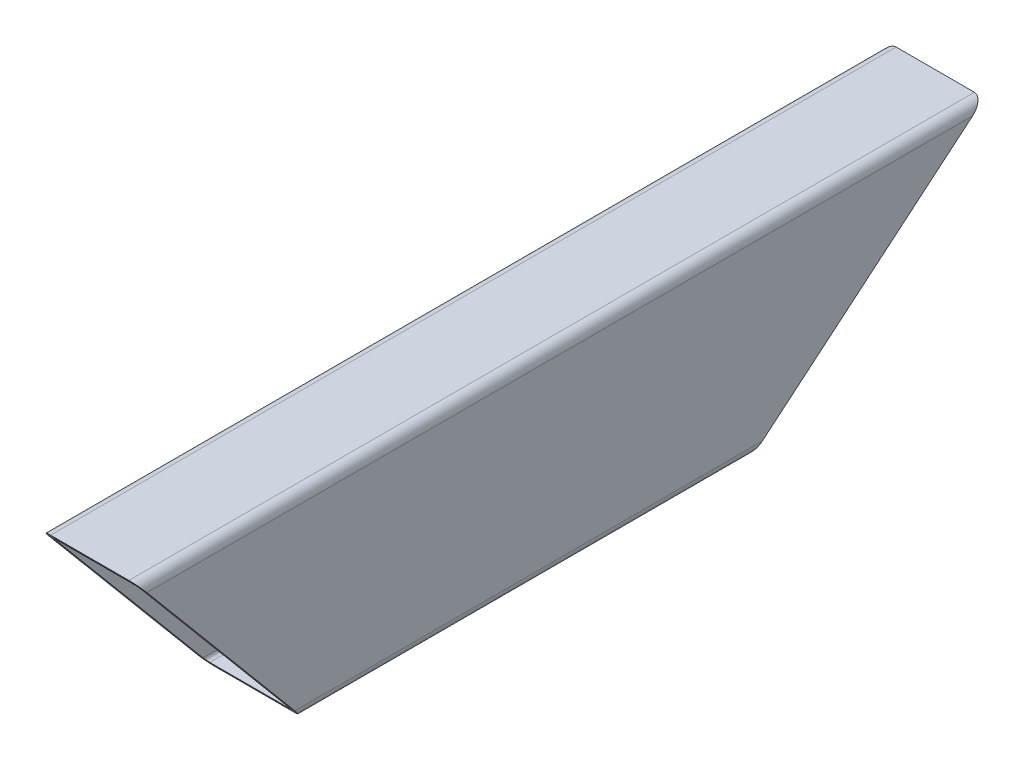
ISO-10303-21;
HEADER;
FILE_DESCRIPTION(('STEP AP214'),'2;1');
FILE_NAME('part.step','',(''),(''),'','','');
FILE_SCHEMA(('AUTOMOTIVE_DESIGN { 1 0 10303 214 1 1 1 1 }'));
ENDSEC;
DATA;
#1=APPLICATION_CONTEXT('core data for automotive mechanical design processes');
#2=APPLICATION_PROTOCOL_DEFINITION('international standard','automotive_design',2000,#1);
#3=PRODUCT_CONTEXT('',#1,'mechanical');
#4=PRODUCT('Part','Part','',(#3));
#5=PRODUCT_RELATED_PRODUCT_CATEGORY('part','',(#4));
#6=PRODUCT_DEFINITION_FORMATION('','',#4);
#7=PRODUCT_DEFINITION_CONTEXT('part definition',#1,'design');
#8=PRODUCT_DEFINITION('design','',#6,#7);
#9=PRODUCT_DEFINITION_SHAPE('','',#8);
#10=(LENGTH_UNIT() NAMED_UNIT(*) SI_UNIT(.MILLI.,.METRE.));
#11=(NAMED_UNIT(*) PLANE_ANGLE_UNIT() SI_UNIT($,.RADIAN.));
#12=(NAMED_UNIT(*) SI_UNIT($,.STERADIAN.) SOLID_ANGLE_UNIT());
#13=UNCERTAINTY_MEASURE_WITH_UNIT(LENGTH_MEASURE(1.E-05),#10,'distance_accuracy_value','');
#14=(GEOMETRIC_REPRESENTATION_CONTEXT(3) GLOBAL_UNCERTAINTY_ASSIGNED_CONTEXT((#13)) GLOBAL_UNIT_ASSIGNED_CONTEXT((#10,
#11,#12)) REPRESENTATION_CONTEXT('',''));
#15=CARTESIAN_POINT('',(0.,0.,0.));
#16=DIRECTION('',(0.,0.,1.));
#17=DIRECTION('',(1.,0.,0.));
#18=AXIS2_PLACEMENT_3D('',#15,#16,#17);
#19=CARTESIAN_POINT('',(-11.1125,-22.86,219.218051789231));
#20=DIRECTION('',(1.,0.,0.));
#21=DIRECTION('',(0.,0.,-1.));
#22=AXIS2_PLACEMENT_3D('',#19,#20,#21);
#23=PLANE('',#22);
#24=DIRECTION('',(0.,0.766044443118982,0.642787609686535));
#25=VECTOR('',#24,1.);
#26=CARTESIAN_POINT('',(-11.1125,-2.9201305271033,195.454640709046));
#27=LINE('',#26,#25);
#28=CARTESIAN_POINT('',(-11.1125,-22.86,178.723103588616));
#29=VERTEX_POINT('',#28);
#30=CARTESIAN_POINT('',(-11.1125,22.86,217.086738726041));
#31=VERTEX_POINT('',#30);
#32=EDGE_CURVE('E12',#29,#31,#27,.T.);
#33=ORIENTED_EDGE('',*,*,#32,.F.);
#34=DIRECTION('',(0.,0.,-1.));
#35=VECTOR('',#34,1.);
#36=CARTESIAN_POINT('',(-11.1125,-22.86,219.218051789231));
#37=LINE('',#36,#35);
#38=CARTESIAN_POINT('',(-11.1125,-22.86,57.5140283785972));
#39=VERTEX_POINT('',#38);
#40=EDGE_CURVE('E289',#29,#39,#37,.T.);
#41=ORIENTED_EDGE('',*,*,#40,.T.);
#42=DIRECTION('',(0.,-0.642787609686535,0.766044443118982));
#43=VECTOR('',#42,1.);
#44=CARTESIAN_POINT('',(-11.1125,-102.48368797403,152.405844577249));
#45=LINE('',#44,#43);
#46=CARTESIAN_POINT('',(-11.1125,22.86,3.02705412518935));
#47=VERTEX_POINT('',#46);
#48=EDGE_CURVE('E103',#47,#39,#45,.T.);
#49=ORIENTED_EDGE('',*,*,#48,.F.);
#50=DIRECTION('',(0.,0.,-1.));
#51=VECTOR('',#50,1.);
#52=CARTESIAN_POINT('',(-11.1125,22.86,219.218051789231));
#53=LINE('',#52,#51);
#54=EDGE_CURVE('E297',#31,#47,#53,.T.);
#55=ORIENTED_EDGE('',*,*,#54,.F.);
#56=EDGE_LOOP('',(#33,#41,#49,#55));
#57=FACE_BOUND('',#56,.T.);
#58=ADVANCED_FACE('F95',(#57),#23,.T.);
#59=CARTESIAN_POINT('',(-10.16,22.86,219.218051789231));
#60=DIRECTION('',(0.,0.,-1.));
#61=DIRECTION('',(-1.,0.,0.));
#62=AXIS2_PLACEMENT_3D('',#59,#60,#61);
#63=CYLINDRICAL_SURFACE('',#62,0.9525);
#64=CARTESIAN_POINT('',(-10.16,22.86,217.086738726041));
#65=DIRECTION('',(0.,0.642787609686535,-0.766044443118982));
#66=DIRECTION('',(0.,-0.766044443118982,-0.642787609686535));
#67=AXIS2_PLACEMENT_3D('',#64,#65,#66);
#68=ELLIPSE('',#67,1.24340044308899,0.9525);
#69=CARTESIAN_POINT('',(-10.16,23.8125,217.885981124737));
#70=VERTEX_POINT('',#69);
#71=EDGE_CURVE('E365',#31,#70,#68,.T.);
#72=ORIENTED_EDGE('',*,*,#71,.F.);
#73=ORIENTED_EDGE('',*,*,#54,.T.);
#74=CARTESIAN_POINT('',(-10.16,22.86,3.0270541251893));
#75=DIRECTION('',(0.,0.766044443118982,0.642787609686535));
#76=DIRECTION('',(0.,0.642787609686535,-0.766044443118982));
#77=AXIS2_PLACEMENT_3D('',#74,#75,#76);
#78=ELLIPSE('',#77,1.48182694508455,0.9525);
#79=CARTESIAN_POINT('',(-10.16,23.8125,1.89190882824328));
#80=VERTEX_POINT('',#79);
#81=EDGE_CURVE('E279',#80,#47,#78,.T.);
#82=ORIENTED_EDGE('',*,*,#81,.F.);
#83=DIRECTION('',(0.,0.,-1.));
#84=VECTOR('',#83,1.);
#85=CARTESIAN_POINT('',(-10.16,23.8125,219.218051789231));
#86=LINE('',#85,#84);
#87=EDGE_CURVE('E301',#70,#80,#86,.T.);
#88=ORIENTED_EDGE('',*,*,#87,.F.);
#89=EDGE_LOOP('',(#72,#73,#82,#88));
#90=FACE_BOUND('',#89,.T.);
#91=ADVANCED_FACE('F416',(#90),#63,.F.);
#92=CARTESIAN_POINT('',(-10.16,23.8125,219.218051789231));
#93=DIRECTION('',(0.,-1.,0.));
#94=DIRECTION('',(0.,0.,-1.));
#95=AXIS2_PLACEMENT_3D('',#92,#93,#94);
#96=PLANE('',#95);
#97=DIRECTION('',(1.,0.,0.));
#98=VECTOR('',#97,1.);
#99=CARTESIAN_POINT('',(-10.16,23.8125,217.885981124737));
#100=LINE('',#99,#98);
#101=CARTESIAN_POINT('',(10.16,23.8125,217.885981124737));
#102=VERTEX_POINT('',#101);
#103=EDGE_CURVE('E363',#70,#102,#100,.T.);
#104=ORIENTED_EDGE('',*,*,#103,.F.);
#105=ORIENTED_EDGE('',*,*,#87,.T.);
#106=DIRECTION('',(-1.,0.,0.));
#107=VECTOR('',#106,1.);
#108=CARTESIAN_POINT('',(-10.16,23.8125,1.89190882824328));
#109=LINE('',#108,#107);
#110=CARTESIAN_POINT('',(10.16,23.8125,1.89190882824328));
#111=VERTEX_POINT('',#110);
#112=EDGE_CURVE('E384',#111,#80,#109,.T.);
#113=ORIENTED_EDGE('',*,*,#112,.F.);
#114=DIRECTION('',(0.,0.,-1.));
#115=VECTOR('',#114,1.);
#116=CARTESIAN_POINT('',(10.16,23.8125,219.218051789231));
#117=LINE('',#116,#115);
#118=EDGE_CURVE('E311',#102,#111,#117,.T.);
#119=ORIENTED_EDGE('',*,*,#118,.F.);
#120=EDGE_LOOP('',(#104,#105,#113,#119));
#121=FACE_BOUND('',#120,.T.);
#122=ADVANCED_FACE('F421',(#121),#96,.T.);
#123=CARTESIAN_POINT('',(10.16,22.86,219.218051789231));
#124=DIRECTION('',(0.,0.,-1.));
#125=DIRECTION('',(-1.,0.,0.));
#126=AXIS2_PLACEMENT_3D('',#123,#124,#125);
#127=CYLINDRICAL_SURFACE('',#126,0.9525);
#128=CARTESIAN_POINT('',(10.16,22.86,217.086738726041));
#129=DIRECTION('',(0.,0.642787609686535,-0.766044443118982));
#130=DIRECTION('',(0.,-0.766044443118982,-0.642787609686535));
#131=AXIS2_PLACEMENT_3D('',#128,#129,#130);
#132=ELLIPSE('',#131,1.24340044308899,0.9525);
#133=CARTESIAN_POINT('',(11.1125,22.86,217.086738726041));
#134=VERTEX_POINT('',#133);
#135=EDGE_CURVE('E361',#102,#134,#132,.T.);
#136=ORIENTED_EDGE('',*,*,#135,.F.);
#137=ORIENTED_EDGE('',*,*,#118,.T.);
#138=CARTESIAN_POINT('',(10.16,22.86,3.0270541251893));
#139=DIRECTION('',(0.,0.766044443118982,0.642787609686535));
#140=DIRECTION('',(0.,0.642787609686535,-0.766044443118982));
#141=AXIS2_PLACEMENT_3D('',#138,#139,#140);
#142=ELLIPSE('',#141,1.48182694508455,0.9525);
#143=CARTESIAN_POINT('',(11.1125,22.86,3.0270541251893));
#144=VERTEX_POINT('',#143);
#145=EDGE_CURVE('E381',#144,#111,#142,.T.);
#146=ORIENTED_EDGE('',*,*,#145,.F.);
#147=DIRECTION('',(0.,0.,-1.));
#148=VECTOR('',#147,1.);
#149=CARTESIAN_POINT('',(11.1125,22.86,219.218051789231));
#150=LINE('',#149,#148);
#151=EDGE_CURVE('E315',#134,#144,#150,.T.);
#152=ORIENTED_EDGE('',*,*,#151,.F.);
#153=EDGE_LOOP('',(#136,#137,#146,#152));
#154=FACE_BOUND('',#153,.T.);
#155=ADVANCED_FACE('F429',(#154),#127,.F.);
#156=CARTESIAN_POINT('',(11.1125,-22.86,219.218051789231));
#157=DIRECTION('',(-1.,0.,0.));
#158=DIRECTION('',(0.,0.,1.));
#159=AXIS2_PLACEMENT_3D('',#156,#157,#158);
#160=PLANE('',#159);
#161=DIRECTION('',(0.,-0.766044443118982,-0.642787609686535));
#162=VECTOR('',#161,1.);
#163=CARTESIAN_POINT('',(11.1125,-2.9201305271033,195.454640709046));
#164=LINE('',#163,#162);
#165=CARTESIAN_POINT('',(11.1125,-22.86,178.723103588616));
#166=VERTEX_POINT('',#165);
#167=EDGE_CURVE('E359',#134,#166,#164,.T.);
#168=ORIENTED_EDGE('',*,*,#167,.F.);
#169=ORIENTED_EDGE('',*,*,#151,.T.);
#170=DIRECTION('',(0.,0.642787609686535,-0.766044443118982));
#171=VECTOR('',#170,1.);
#172=CARTESIAN_POINT('',(11.1125,-102.48368797403,152.405844577249));
#173=LINE('',#172,#171);
#174=CARTESIAN_POINT('',(11.1125,-22.86,57.5140283785972));
#175=VERTEX_POINT('',#174);
#176=EDGE_CURVE('E378',#175,#144,#173,.T.);
#177=ORIENTED_EDGE('',*,*,#176,.F.);
#178=DIRECTION('',(0.,0.,-1.));
#179=VECTOR('',#178,1.);
#180=CARTESIAN_POINT('',(11.1125,-22.86,219.218051789231));
#181=LINE('',#180,#179);
#182=EDGE_CURVE('E318',#166,#175,#181,.T.);
#183=ORIENTED_EDGE('',*,*,#182,.F.);
#184=EDGE_LOOP('',(#168,#169,#177,#183));
#185=FACE_BOUND('',#184,.T.);
#186=ADVANCED_FACE('F433',(#185),#160,.T.);
#187=CARTESIAN_POINT('',(10.16,-22.86,219.218051789231));
#188=DIRECTION('',(0.,0.,-1.));
#189=DIRECTION('',(-1.,0.,0.));
#190=AXIS2_PLACEMENT_3D('',#187,#188,#189);
#191=CYLINDRICAL_SURFACE('',#190,0.9525);
#192=CARTESIAN_POINT('',(10.16,-22.86,178.723103588616));
#193=DIRECTION('',(0.,0.642787609686535,-0.766044443118982));
#194=DIRECTION('',(0.,-0.766044443118982,-0.642787609686535));
#195=AXIS2_PLACEMENT_3D('',#192,#193,#194);
#196=ELLIPSE('',#195,1.24340044308899,0.9525);
#197=CARTESIAN_POINT('',(10.16,-23.8125,177.923861189919));
#198=VERTEX_POINT('',#197);
#199=EDGE_CURVE('E357',#166,#198,#196,.T.);
#200=ORIENTED_EDGE('',*,*,#199,.F.);
#201=ORIENTED_EDGE('',*,*,#182,.T.);
#202=CARTESIAN_POINT('',(10.16,-22.86,57.5140283785972));
#203=DIRECTION('',(0.,0.766044443118982,0.642787609686535));
#204=DIRECTION('',(0.,0.642787609686535,-0.766044443118982));
#205=AXIS2_PLACEMENT_3D('',#202,#203,#204);
#206=ELLIPSE('',#205,1.48182694508455,0.9525);
#207=CARTESIAN_POINT('',(10.16,-23.8125,58.6491736755432));
#208=VERTEX_POINT('',#207);
#209=EDGE_CURVE('E375',#208,#175,#206,.T.);
#210=ORIENTED_EDGE('',*,*,#209,.F.);
#211=DIRECTION('',(0.,0.,-1.));
#212=VECTOR('',#211,1.);
#213=CARTESIAN_POINT('',(10.16,-23.8125,219.218051789231));
#214=LINE('',#213,#212);
#215=EDGE_CURVE('E322',#198,#208,#214,.T.);
#216=ORIENTED_EDGE('',*,*,#215,.F.);
#217=EDGE_LOOP('',(#200,#201,#210,#216));
#218=FACE_BOUND('',#217,.T.);
#219=ADVANCED_FACE('F437',(#218),#191,.F.);
#220=CARTESIAN_POINT('',(-10.16,-23.8125,219.218051789231));
#221=DIRECTION('',(0.,1.,0.));
#222=DIRECTION('',(0.,0.,1.));
#223=AXIS2_PLACEMENT_3D('',#220,#221,#222);
#224=PLANE('',#223);
#225=DIRECTION('',(-1.,0.,0.));
#226=VECTOR('',#225,1.);
#227=CARTESIAN_POINT('',(-10.16,-23.8125,177.923861189919));
#228=LINE('',#227,#226);
#229=CARTESIAN_POINT('',(-10.16,-23.8125,177.923861189919));
#230=VERTEX_POINT('',#229);
#231=EDGE_CURVE('E355',#198,#230,#228,.T.);
#232=ORIENTED_EDGE('',*,*,#231,.F.);
#233=ORIENTED_EDGE('',*,*,#215,.T.);
#234=DIRECTION('',(1.,0.,0.));
#235=VECTOR('',#234,1.);
#236=CARTESIAN_POINT('',(-10.16,-23.8125,58.6491736755432));
#237=LINE('',#236,#235);
#238=CARTESIAN_POINT('',(-10.16,-23.8125,58.6491736755432));
#239=VERTEX_POINT('',#238);
#240=EDGE_CURVE('E293',#239,#208,#237,.T.);
#241=ORIENTED_EDGE('',*,*,#240,.F.);
#242=DIRECTION('',(0.,0.,-1.));
#243=VECTOR('',#242,1.);
#244=CARTESIAN_POINT('',(-10.16,-23.8125,219.218051789231));
#245=LINE('',#244,#243);
#246=EDGE_CURVE('E291',#230,#239,#245,.T.);
#247=ORIENTED_EDGE('',*,*,#246,.F.);
#248=EDGE_LOOP('',(#232,#233,#241,#247));
#249=FACE_BOUND('',#248,.T.);
#250=ADVANCED_FACE('F441',(#249),#224,.T.);
#251=CARTESIAN_POINT('',(-10.16,-22.86,219.218051789231));
#252=DIRECTION('',(0.,0.,-1.));
#253=DIRECTION('',(-1.,0.,0.));
#254=AXIS2_PLACEMENT_3D('',#251,#252,#253);
#255=CYLINDRICAL_SURFACE('',#254,0.9525);
#256=CARTESIAN_POINT('',(-10.16,-22.86,178.723103588616));
#257=DIRECTION('',(0.,0.642787609686535,-0.766044443118982));
#258=DIRECTION('',(0.,-0.766044443118982,-0.642787609686535));
#259=AXIS2_PLACEMENT_3D('',#256,#257,#258);
#260=ELLIPSE('',#259,1.24340044308899,0.9525);
#261=EDGE_CURVE('E351',#230,#29,#260,.T.);
#262=ORIENTED_EDGE('',*,*,#261,.F.);
#263=ORIENTED_EDGE('',*,*,#246,.T.);
#264=CARTESIAN_POINT('',(-10.16,-22.86,57.5140283785972));
#265=DIRECTION('',(0.,0.766044443118982,0.642787609686535));
#266=DIRECTION('',(0.,0.642787609686535,-0.766044443118982));
#267=AXIS2_PLACEMENT_3D('',#264,#265,#266);
#268=ELLIPSE('',#267,1.48182694508455,0.9525);
#269=EDGE_CURVE('E276',#39,#239,#268,.T.);
#270=ORIENTED_EDGE('',*,*,#269,.F.);
#271=ORIENTED_EDGE('',*,*,#40,.F.);
#272=EDGE_LOOP('',(#262,#263,#270,#271));
#273=FACE_BOUND('',#272,.T.);
#274=ADVANCED_FACE('F288',(#273),#255,.F.);
#275=CARTESIAN_POINT('',(-12.7,25.4,0.));
#276=DIRECTION('',(0.,0.766044443118982,0.642787609686535));
#277=DIRECTION('',(0.,-0.642787609686535,0.766044443118982));
#278=AXIS2_PLACEMENT_3D('',#275,#276,#277);
#279=PLANE('',#278);
#280=ORIENTED_EDGE('',*,*,#269,.T.);
#281=ORIENTED_EDGE('',*,*,#240,.T.);
#282=ORIENTED_EDGE('',*,*,#209,.T.);
#283=ORIENTED_EDGE('',*,*,#176,.T.);
#284=ORIENTED_EDGE('',*,*,#145,.T.);
#285=ORIENTED_EDGE('',*,*,#112,.T.);
#286=ORIENTED_EDGE('',*,*,#81,.T.);
#287=ORIENTED_EDGE('',*,*,#48,.T.);
#288=EDGE_LOOP('',(#280,#281,#282,#283,#284,#285,#286,#287));
#289=FACE_BOUND('',#288,.T.);
#290=DIRECTION('',(0.,-0.642787609686535,0.766044443118982));
#291=VECTOR('',#290,1.);
#292=CARTESIAN_POINT('',(-12.7,25.4,0.));
#293=LINE('',#292,#291);
#294=CARTESIAN_POINT('',(-12.7,22.86,3.02705412518932));
#295=VERTEX_POINT('',#294);
#296=CARTESIAN_POINT('',(-12.7,-22.86,57.5140283785972));
#297=VERTEX_POINT('',#296);
#298=EDGE_CURVE('E246',#295,#297,#293,.T.);
#299=ORIENTED_EDGE('',*,*,#298,.F.);
#300=CARTESIAN_POINT('',(-10.16,22.86,3.0270541251893));
#301=DIRECTION('',(0.,0.766044443118982,0.642787609686535));
#302=DIRECTION('',(0.,0.642787609686535,-0.766044443118982));
#303=AXIS2_PLACEMENT_3D('',#300,#301,#302);
#304=ELLIPSE('',#303,3.95153852022547,2.54);
#305=CARTESIAN_POINT('',(-10.16,25.4,0.));
#306=VERTEX_POINT('',#305);
#307=EDGE_CURVE('E234',#306,#295,#304,.T.);
#308=ORIENTED_EDGE('',*,*,#307,.F.);
#309=DIRECTION('',(-1.,0.,0.));
#310=VECTOR('',#309,1.);
#311=CARTESIAN_POINT('',(-10.16,25.4,0.));
#312=LINE('',#311,#310);
#313=CARTESIAN_POINT('',(10.16,25.4,0.));
#314=VERTEX_POINT('',#313);
#315=EDGE_CURVE('E227',#314,#306,#312,.T.);
#316=ORIENTED_EDGE('',*,*,#315,.F.);
#317=CARTESIAN_POINT('',(10.16,22.86,3.0270541251893));
#318=DIRECTION('',(0.,0.766044443118982,0.642787609686535));
#319=DIRECTION('',(0.,0.642787609686535,-0.766044443118982));
#320=AXIS2_PLACEMENT_3D('',#317,#318,#319);
#321=ELLIPSE('',#320,3.95153852022547,2.54);
#322=CARTESIAN_POINT('',(12.7,22.86,3.02705412518941));
#323=VERTEX_POINT('',#322);
#324=EDGE_CURVE('E221',#323,#314,#321,.T.);
#325=ORIENTED_EDGE('',*,*,#324,.F.);
#326=DIRECTION('',(0.,-0.642787609686535,0.766044443118982));
#327=VECTOR('',#326,1.);
#328=CARTESIAN_POINT('',(12.7,25.4,0.));
#329=LINE('',#328,#327);
#330=CARTESIAN_POINT('',(12.7,-22.86,57.5140283785972));
#331=VERTEX_POINT('',#330);
#332=EDGE_CURVE('E224',#323,#331,#329,.T.);
#333=ORIENTED_EDGE('',*,*,#332,.T.);
#334=CARTESIAN_POINT('',(10.16,-22.86,57.5140283785972));
#335=DIRECTION('',(0.,0.766044443118982,0.642787609686535));
#336=DIRECTION('',(0.,0.642787609686535,-0.766044443118982));
#337=AXIS2_PLACEMENT_3D('',#334,#335,#336);
#338=ELLIPSE('',#337,3.95153852022547,2.54);
#339=CARTESIAN_POINT('',(10.16,-25.4,60.5410825037865));
#340=VERTEX_POINT('',#339);
#341=EDGE_CURVE('E233',#340,#331,#338,.T.);
#342=ORIENTED_EDGE('',*,*,#341,.F.);
#343=DIRECTION('',(1.,0.,0.));
#344=VECTOR('',#343,1.);
#345=CARTESIAN_POINT('',(-12.7,-25.4,60.5410825037865));
#346=LINE('',#345,#344);
#347=CARTESIAN_POINT('',(-10.16,-25.4,60.5410825037865));
#348=VERTEX_POINT('',#347);
#349=EDGE_CURVE('E389',#348,#340,#346,.T.);
#350=ORIENTED_EDGE('',*,*,#349,.F.);
#351=CARTESIAN_POINT('',(-10.16,-22.86,57.5140283785972));
#352=DIRECTION('',(0.,0.766044443118982,0.642787609686535));
#353=DIRECTION('',(0.,0.642787609686535,-0.766044443118982));
#354=AXIS2_PLACEMENT_3D('',#351,#352,#353);
#355=ELLIPSE('',#354,3.95153852022547,2.54);
#356=EDGE_CURVE('E121',#297,#348,#355,.T.);
#357=ORIENTED_EDGE('',*,*,#356,.F.);
#358=EDGE_LOOP('',(#299,#308,#316,#325,#333,#342,#350,#357));
#359=FACE_BOUND('',#358,.T.);
#360=ADVANCED_FACE('F223',(#289,#359),#279,.F.);
#361=CARTESIAN_POINT('',(-12.7,25.4,219.218051789231));
#362=DIRECTION('',(0.,0.642787609686535,-0.766044443118982));
#363=DIRECTION('',(0.,0.766044443118982,0.642787609686535));
#364=AXIS2_PLACEMENT_3D('',#361,#362,#363);
#365=PLANE('',#364);
#366=ORIENTED_EDGE('',*,*,#261,.T.);
#367=ORIENTED_EDGE('',*,*,#32,.T.);
#368=ORIENTED_EDGE('',*,*,#71,.T.);
#369=ORIENTED_EDGE('',*,*,#103,.T.);
#370=ORIENTED_EDGE('',*,*,#135,.T.);
#371=ORIENTED_EDGE('',*,*,#167,.T.);
#372=ORIENTED_EDGE('',*,*,#199,.T.);
#373=ORIENTED_EDGE('',*,*,#231,.T.);
#374=EDGE_LOOP('',(#366,#367,#368,#369,#370,#371,#372,#373));
#375=FACE_BOUND('',#374,.T.);
#376=DIRECTION('',(1.,0.,0.));
#377=VECTOR('',#376,1.);
#378=CARTESIAN_POINT('',(-12.7,-25.4,176.591790525426));
#379=LINE('',#378,#377);
#380=CARTESIAN_POINT('',(-10.16,-25.4,176.591790525426));
#381=VERTEX_POINT('',#380);
#382=CARTESIAN_POINT('',(10.16,-25.4,176.591790525426));
#383=VERTEX_POINT('',#382);
#384=EDGE_CURVE('E388',#381,#383,#379,.T.);
#385=ORIENTED_EDGE('',*,*,#384,.T.);
#386=CARTESIAN_POINT('',(10.16,-22.86,178.723103588616));
#387=DIRECTION('',(0.,0.642787609686535,-0.766044443118982));
#388=DIRECTION('',(0.,-0.766044443118982,-0.642787609686535));
#389=AXIS2_PLACEMENT_3D('',#386,#387,#388);
#390=ELLIPSE('',#389,3.31573451490397,2.54);
#391=CARTESIAN_POINT('',(12.7,-22.86,178.723103588616));
#392=VERTEX_POINT('',#391);
#393=EDGE_CURVE('E304',#392,#383,#390,.T.);
#394=ORIENTED_EDGE('',*,*,#393,.F.);
#395=DIRECTION('',(0.,0.766044443118982,0.642787609686535));
#396=VECTOR('',#395,1.);
#397=CARTESIAN_POINT('',(12.7,25.4,219.218051789231));
#398=LINE('',#397,#396);
#399=CARTESIAN_POINT('',(12.7,22.86,217.086738726041));
#400=VERTEX_POINT('',#399);
#401=EDGE_CURVE('E245',#392,#400,#398,.T.);
#402=ORIENTED_EDGE('',*,*,#401,.T.);
#403=CARTESIAN_POINT('',(10.16,22.86,217.086738726041));
#404=DIRECTION('',(0.,0.642787609686535,-0.766044443118982));
#405=DIRECTION('',(0.,-0.766044443118982,-0.642787609686535));
#406=AXIS2_PLACEMENT_3D('',#403,#404,#405);
#407=ELLIPSE('',#406,3.31573451490397,2.54);
#408=CARTESIAN_POINT('',(10.16,25.4,219.218051789231));
#409=VERTEX_POINT('',#408);
#410=EDGE_CURVE('E250',#409,#400,#407,.T.);
#411=ORIENTED_EDGE('',*,*,#410,.F.);
#412=DIRECTION('',(-1.,0.,0.));
#413=VECTOR('',#412,1.);
#414=CARTESIAN_POINT('',(-10.16,25.4,219.218051789231));
#415=LINE('',#414,#413);
#416=CARTESIAN_POINT('',(-10.16,25.4,219.218051789231));
#417=VERTEX_POINT('',#416);
#418=EDGE_CURVE('E328',#409,#417,#415,.T.);
#419=ORIENTED_EDGE('',*,*,#418,.T.);
#420=CARTESIAN_POINT('',(-10.16,22.86,217.086738726041));
#421=DIRECTION('',(0.,0.642787609686535,-0.766044443118982));
#422=DIRECTION('',(0.,-0.766044443118982,-0.642787609686535));
#423=AXIS2_PLACEMENT_3D('',#420,#421,#422);
#424=ELLIPSE('',#423,3.31573451490397,2.54);
#425=CARTESIAN_POINT('',(-12.7,22.86,217.086738726041));
#426=VERTEX_POINT('',#425);
#427=EDGE_CURVE('E110',#426,#417,#424,.T.);
#428=ORIENTED_EDGE('',*,*,#427,.F.);
#429=DIRECTION('',(0.,0.766044443118982,0.642787609686535));
#430=VECTOR('',#429,1.);
#431=CARTESIAN_POINT('',(-12.7,25.4,219.218051789231));
#432=LINE('',#431,#430);
#433=CARTESIAN_POINT('',(-12.7,-22.86,178.723103588616));
#434=VERTEX_POINT('',#433);
#435=EDGE_CURVE('E395',#434,#426,#432,.T.);
#436=ORIENTED_EDGE('',*,*,#435,.F.);
#437=CARTESIAN_POINT('',(-10.16,-22.86,178.723103588616));
#438=DIRECTION('',(0.,0.642787609686535,-0.766044443118982));
#439=DIRECTION('',(0.,-0.766044443118982,-0.642787609686535));
#440=AXIS2_PLACEMENT_3D('',#437,#438,#439);
#441=ELLIPSE('',#440,3.31573451490397,2.54);
#442=EDGE_CURVE('E298',#381,#434,#441,.T.);
#443=ORIENTED_EDGE('',*,*,#442,.F.);
#444=EDGE_LOOP('',(#385,#394,#402,#411,#419,#428,#436,#443));
#445=FACE_BOUND('',#444,.T.);
#446=ADVANCED_FACE('F348',(#375,#445),#365,.F.);
#447=CARTESIAN_POINT('',(-10.16,-22.86,219.218051789231));
#448=DIRECTION('',(0.,0.,-1.));
#449=DIRECTION('',(-1.,0.,0.));
#450=AXIS2_PLACEMENT_3D('',#447,#448,#449);
#451=CYLINDRICAL_SURFACE('',#450,2.54);
#452=DIRECTION('',(0.,0.,-1.));
#453=VECTOR('',#452,1.);
#454=CARTESIAN_POINT('',(-10.16,-25.4,219.218051789231));
#455=LINE('',#454,#453);
#456=EDGE_CURVE('E267',#381,#348,#455,.T.);
#457=ORIENTED_EDGE('',*,*,#456,.F.);
#458=ORIENTED_EDGE('',*,*,#442,.T.);
#459=DIRECTION('',(0.,0.,-1.));
#460=VECTOR('',#459,1.);
#461=CARTESIAN_POINT('',(-12.7,-22.86,219.218051789231));
#462=LINE('',#461,#460);
#463=EDGE_CURVE('E330',#434,#297,#462,.T.);
#464=ORIENTED_EDGE('',*,*,#463,.T.);
#465=ORIENTED_EDGE('',*,*,#356,.T.);
#466=EDGE_LOOP('',(#457,#458,#464,#465));
#467=FACE_BOUND('',#466,.T.);
#468=ADVANCED_FACE('F97',(#467),#451,.T.);
#469=CARTESIAN_POINT('',(-10.16,-25.4,219.218051789231));
#470=DIRECTION('',(0.,1.,0.));
#471=DIRECTION('',(0.,0.,1.));
#472=AXIS2_PLACEMENT_3D('',#469,#470,#471);
#473=PLANE('',#472);
#474=DIRECTION('',(0.,0.,-1.));
#475=VECTOR('',#474,1.);
#476=CARTESIAN_POINT('',(10.16,-25.4,219.218051789231));
#477=LINE('',#476,#475);
#478=EDGE_CURVE('E257',#383,#340,#477,.T.);
#479=ORIENTED_EDGE('',*,*,#478,.F.);
#480=ORIENTED_EDGE('',*,*,#384,.F.);
#481=ORIENTED_EDGE('',*,*,#456,.T.);
#482=ORIENTED_EDGE('',*,*,#349,.T.);
#483=EDGE_LOOP('',(#479,#480,#481,#482));
#484=FACE_BOUND('',#483,.T.);
#485=ADVANCED_FACE('F405',(#484),#473,.F.);
#486=CARTESIAN_POINT('',(10.16,-22.86,219.218051789231));
#487=DIRECTION('',(0.,0.,-1.));
#488=DIRECTION('',(-1.,0.,0.));
#489=AXIS2_PLACEMENT_3D('',#486,#487,#488);
#490=CYLINDRICAL_SURFACE('',#489,2.54);
#491=DIRECTION('',(0.,0.,-1.));
#492=VECTOR('',#491,1.);
#493=CARTESIAN_POINT('',(12.7,-22.86,219.218051789231));
#494=LINE('',#493,#492);
#495=EDGE_CURVE('E243',#392,#331,#494,.T.);
#496=ORIENTED_EDGE('',*,*,#495,.F.);
#497=ORIENTED_EDGE('',*,*,#393,.T.);
#498=ORIENTED_EDGE('',*,*,#478,.T.);
#499=ORIENTED_EDGE('',*,*,#341,.T.);
#500=EDGE_LOOP('',(#496,#497,#498,#499));
#501=FACE_BOUND('',#500,.T.);
#502=ADVANCED_FACE('F407',(#501),#490,.T.);
#503=CARTESIAN_POINT('',(12.7,-22.86,219.218051789231));
#504=DIRECTION('',(-1.,0.,0.));
#505=DIRECTION('',(0.,0.,1.));
#506=AXIS2_PLACEMENT_3D('',#503,#504,#505);
#507=PLANE('',#506);
#508=DIRECTION('',(0.,0.,-1.));
#509=VECTOR('',#508,1.);
#510=CARTESIAN_POINT('',(12.7,22.86,219.218051789231));
#511=LINE('',#510,#509);
#512=EDGE_CURVE('E241',#400,#323,#511,.T.);
#513=ORIENTED_EDGE('',*,*,#512,.F.);
#514=ORIENTED_EDGE('',*,*,#401,.F.);
#515=ORIENTED_EDGE('',*,*,#495,.T.);
#516=ORIENTED_EDGE('',*,*,#332,.F.);
#517=EDGE_LOOP('',(#513,#514,#515,#516));
#518=FACE_BOUND('',#517,.T.);
#519=ADVANCED_FACE('F239',(#518),#507,.F.);
#520=CARTESIAN_POINT('',(10.16,22.86,219.218051789231));
#521=DIRECTION('',(0.,0.,-1.));
#522=DIRECTION('',(-1.,0.,0.));
#523=AXIS2_PLACEMENT_3D('',#520,#521,#522);
#524=CYLINDRICAL_SURFACE('',#523,2.54);
#525=DIRECTION('',(0.,0.,-1.));
#526=VECTOR('',#525,1.);
#527=CARTESIAN_POINT('',(10.16,25.4,219.218051789231));
#528=LINE('',#527,#526);
#529=EDGE_CURVE('E252',#409,#314,#528,.T.);
#530=ORIENTED_EDGE('',*,*,#529,.F.);
#531=ORIENTED_EDGE('',*,*,#410,.T.);
#532=ORIENTED_EDGE('',*,*,#512,.T.);
#533=ORIENTED_EDGE('',*,*,#324,.T.);
#534=EDGE_LOOP('',(#530,#531,#532,#533));
#535=FACE_BOUND('',#534,.T.);
#536=ADVANCED_FACE('F249',(#535),#524,.T.);
#537=CARTESIAN_POINT('',(-10.16,25.4,219.218051789231));
#538=DIRECTION('',(0.,-1.,0.));
#539=DIRECTION('',(0.,0.,-1.));
#540=AXIS2_PLACEMENT_3D('',#537,#538,#539);
#541=PLANE('',#540);
#542=ORIENTED_EDGE('',*,*,#315,.T.);
#543=DIRECTION('',(0.,0.,-1.));
#544=VECTOR('',#543,1.);
#545=CARTESIAN_POINT('',(-10.16,25.4,219.218051789231));
#546=LINE('',#545,#544);
#547=EDGE_CURVE('E260',#417,#306,#546,.T.);
#548=ORIENTED_EDGE('',*,*,#547,.F.);
#549=ORIENTED_EDGE('',*,*,#418,.F.);
#550=ORIENTED_EDGE('',*,*,#529,.T.);
#551=EDGE_LOOP('',(#542,#548,#549,#550));
#552=FACE_BOUND('',#551,.T.);
#553=ADVANCED_FACE('F347',(#552),#541,.F.);
#554=CARTESIAN_POINT('',(-10.16,22.86,219.218051789231));
#555=DIRECTION('',(0.,0.,-1.));
#556=DIRECTION('',(-1.,0.,0.));
#557=AXIS2_PLACEMENT_3D('',#554,#555,#556);
#558=CYLINDRICAL_SURFACE('',#557,2.54);
#559=DIRECTION('',(0.,0.,-1.));
#560=VECTOR('',#559,1.);
#561=CARTESIAN_POINT('',(-12.7,22.86,219.218051789231));
#562=LINE('',#561,#560);
#563=EDGE_CURVE('E335',#426,#295,#562,.T.);
#564=ORIENTED_EDGE('',*,*,#563,.F.);
#565=ORIENTED_EDGE('',*,*,#427,.T.);
#566=ORIENTED_EDGE('',*,*,#547,.T.);
#567=ORIENTED_EDGE('',*,*,#307,.T.);
#568=EDGE_LOOP('',(#564,#565,#566,#567));
#569=FACE_BOUND('',#568,.T.);
#570=ADVANCED_FACE('F344',(#569),#558,.T.);
#571=CARTESIAN_POINT('',(-12.7,-22.86,219.218051789231));
#572=DIRECTION('',(1.,0.,0.));
#573=DIRECTION('',(0.,0.,-1.));
#574=AXIS2_PLACEMENT_3D('',#571,#572,#573);
#575=PLANE('',#574);
#576=ORIENTED_EDGE('',*,*,#463,.F.);
#577=ORIENTED_EDGE('',*,*,#435,.T.);
#578=ORIENTED_EDGE('',*,*,#563,.T.);
#579=ORIENTED_EDGE('',*,*,#298,.T.);
#580=EDGE_LOOP('',(#576,#577,#578,#579));
#581=FACE_BOUND('',#580,.T.);
#582=ADVANCED_FACE('F399',(#581),#575,.F.);
#583=CLOSED_SHELL('',(#58,#91,#122,#155,#186,#219,#250,#274,#360,#446,#468,#485,#502,#519,#536,
#553,#570,#582));
#584=MANIFOLD_SOLID_BREP('B2',#583);
#585=ADVANCED_BREP_SHAPE_REPRESENTATION('',(#18,#584),#14);
#586=SHAPE_DEFINITION_REPRESENTATION(#9,#585);
ENDSEC;
END-ISO-10303-21;
